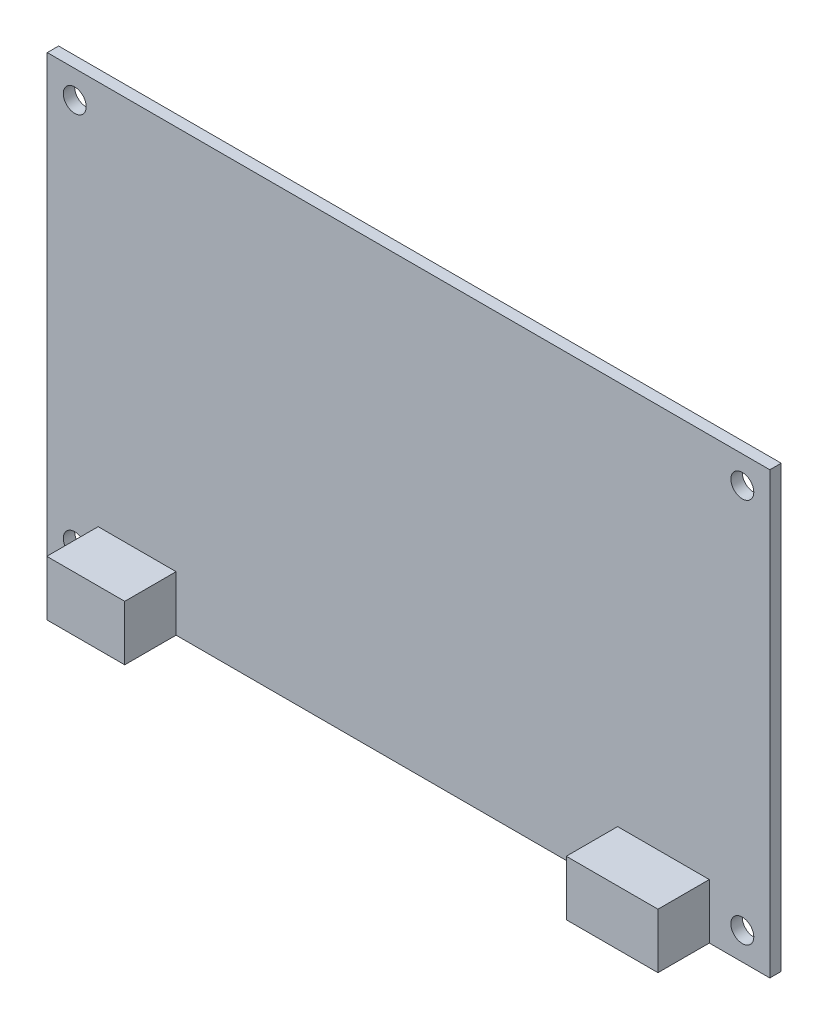
ISO-10303-21;
HEADER;
FILE_DESCRIPTION(('STEP AP214'),'2;1');
FILE_NAME('part.step','',(''),(''),'','','');
FILE_SCHEMA(('AUTOMOTIVE_DESIGN { 1 0 10303 214 1 1 1 1 }'));
ENDSEC;
DATA;
#1=APPLICATION_CONTEXT('core data for automotive mechanical design processes');
#2=APPLICATION_PROTOCOL_DEFINITION('international standard','automotive_design',2000,#1);
#3=PRODUCT_CONTEXT('',#1,'mechanical');
#4=PRODUCT('Part','Part','',(#3));
#5=PRODUCT_RELATED_PRODUCT_CATEGORY('part','',(#4));
#6=PRODUCT_DEFINITION_FORMATION('','',#4);
#7=PRODUCT_DEFINITION_CONTEXT('part definition',#1,'design');
#8=PRODUCT_DEFINITION('design','',#6,#7);
#9=PRODUCT_DEFINITION_SHAPE('','',#8);
#10=(LENGTH_UNIT() NAMED_UNIT(*) SI_UNIT(.MILLI.,.METRE.));
#11=(NAMED_UNIT(*) PLANE_ANGLE_UNIT() SI_UNIT($,.RADIAN.));
#12=(NAMED_UNIT(*) SI_UNIT($,.STERADIAN.) SOLID_ANGLE_UNIT());
#13=UNCERTAINTY_MEASURE_WITH_UNIT(LENGTH_MEASURE(1.E-05),#10,'distance_accuracy_value','');
#14=(GEOMETRIC_REPRESENTATION_CONTEXT(3) GLOBAL_UNCERTAINTY_ASSIGNED_CONTEXT((#13)) GLOBAL_UNIT_ASSIGNED_CONTEXT((#10,
#11,#12)) REPRESENTATION_CONTEXT('',''));
#15=CARTESIAN_POINT('',(0.,0.,0.));
#16=DIRECTION('',(0.,0.,1.));
#17=DIRECTION('',(1.,0.,0.));
#18=AXIS2_PLACEMENT_3D('',#15,#16,#17);
#19=CARTESIAN_POINT('',(0.,60.96,1.5748));
#20=DIRECTION('',(0.,0.,-1.));
#21=DIRECTION('',(-1.,0.,0.));
#22=AXIS2_PLACEMENT_3D('',#19,#20,#21);
#23=PLANE('',#22);
#24=CARTESIAN_POINT('',(96.266,3.80999999999999,1.5748));
#25=DIRECTION('',(0.,0.,1.));
#26=DIRECTION('',(1.,0.,0.));
#27=AXIS2_PLACEMENT_3D('',#24,#25,#26);
#28=CIRCLE('',#27,1.5875);
#29=CARTESIAN_POINT('',(97.8535,3.80999999999999,1.5748));
#30=VERTEX_POINT('',#29);
#31=EDGE_CURVE('E267',#30,#30,#28,.T.);
#32=ORIENTED_EDGE('',*,*,#31,.F.);
#33=EDGE_LOOP('',(#32));
#34=FACE_BOUND('',#33,.T.);
#35=CARTESIAN_POINT('',(3.81,57.15,1.5748));
#36=DIRECTION('',(0.,0.,1.));
#37=DIRECTION('',(1.,0.,0.));
#38=AXIS2_PLACEMENT_3D('',#35,#36,#37);
#39=CIRCLE('',#38,1.5875);
#40=CARTESIAN_POINT('',(5.3975,57.15,1.5748));
#41=VERTEX_POINT('',#40);
#42=EDGE_CURVE('E211',#41,#41,#39,.T.);
#43=ORIENTED_EDGE('',*,*,#42,.F.);
#44=EDGE_LOOP('',(#43));
#45=FACE_BOUND('',#44,.T.);
#46=CARTESIAN_POINT('',(96.266,57.15,1.5748));
#47=DIRECTION('',(0.,0.,1.));
#48=DIRECTION('',(1.,0.,0.));
#49=AXIS2_PLACEMENT_3D('',#46,#47,#48);
#50=CIRCLE('',#49,1.58749999999999);
#51=CARTESIAN_POINT('',(97.8535,57.15,1.5748));
#52=VERTEX_POINT('',#51);
#53=EDGE_CURVE('E273',#52,#52,#50,.T.);
#54=ORIENTED_EDGE('',*,*,#53,.F.);
#55=EDGE_LOOP('',(#54));
#56=FACE_BOUND('',#55,.T.);
#57=CARTESIAN_POINT('',(3.81,3.80999999999999,1.5748));
#58=DIRECTION('',(0.,0.,1.));
#59=DIRECTION('',(1.,0.,0.));
#60=AXIS2_PLACEMENT_3D('',#57,#58,#59);
#61=CIRCLE('',#60,1.5875);
#62=CARTESIAN_POINT('',(5.3975,3.80999999999999,1.5748));
#63=VERTEX_POINT('',#62);
#64=EDGE_CURVE('E261',#63,#63,#61,.T.);
#65=ORIENTED_EDGE('',*,*,#64,.F.);
#66=EDGE_LOOP('',(#65));
#67=FACE_BOUND('',#66,.T.);
#68=DIRECTION('',(0.,1.,0.));
#69=VECTOR('',#68,1.);
#70=CARTESIAN_POINT('',(91.694,7.62,1.5748));
#71=LINE('',#70,#69);
#72=CARTESIAN_POINT('',(91.694,0.,1.5748));
#73=VERTEX_POINT('',#72);
#74=CARTESIAN_POINT('',(91.694,7.62,1.5748));
#75=VERTEX_POINT('',#74);
#76=EDGE_CURVE('E144',#73,#75,#71,.T.);
#77=ORIENTED_EDGE('',*,*,#76,.F.);
#78=DIRECTION('',(1.,0.,0.));
#79=VECTOR('',#78,1.);
#80=CARTESIAN_POINT('',(0.,0.,1.5748));
#81=LINE('',#80,#79);
#82=CARTESIAN_POINT('',(100.076,0.,1.5748));
#83=VERTEX_POINT('',#82);
#84=EDGE_CURVE('E36',#73,#83,#81,.T.);
#85=ORIENTED_EDGE('',*,*,#84,.T.);
#86=DIRECTION('',(0.,1.,0.));
#87=VECTOR('',#86,1.);
#88=CARTESIAN_POINT('',(100.076,0.,1.5748));
#89=LINE('',#88,#87);
#90=CARTESIAN_POINT('',(100.076,60.96,1.5748));
#91=VERTEX_POINT('',#90);
#92=EDGE_CURVE('E200',#83,#91,#89,.T.);
#93=ORIENTED_EDGE('',*,*,#92,.T.);
#94=DIRECTION('',(-1.,0.,0.));
#95=VECTOR('',#94,1.);
#96=CARTESIAN_POINT('',(0.,60.96,1.5748));
#97=LINE('',#96,#95);
#98=CARTESIAN_POINT('',(0.,60.96,1.5748));
#99=VERTEX_POINT('',#98);
#100=EDGE_CURVE('E204',#91,#99,#97,.T.);
#101=ORIENTED_EDGE('',*,*,#100,.T.);
#102=DIRECTION('',(0.,-1.,0.));
#103=VECTOR('',#102,1.);
#104=CARTESIAN_POINT('',(0.,0.,1.5748));
#105=LINE('',#104,#103);
#106=CARTESIAN_POINT('',(0.,0.,1.5748));
#107=VERTEX_POINT('',#106);
#108=EDGE_CURVE('E198',#99,#107,#105,.T.);
#109=ORIENTED_EDGE('',*,*,#108,.T.);
#110=CARTESIAN_POINT('',(7.0485,0.,1.5748));
#111=VERTEX_POINT('',#110);
#112=EDGE_CURVE('E194',#107,#111,#81,.T.);
#113=ORIENTED_EDGE('',*,*,#112,.T.);
#114=DIRECTION('',(0.,-1.,0.));
#115=VECTOR('',#114,1.);
#116=CARTESIAN_POINT('',(7.0485,7.62,1.5748));
#117=LINE('',#116,#115);
#118=CARTESIAN_POINT('',(7.0485,7.62,1.5748));
#119=VERTEX_POINT('',#118);
#120=EDGE_CURVE('E158',#119,#111,#117,.T.);
#121=ORIENTED_EDGE('',*,*,#120,.F.);
#122=DIRECTION('',(-1.,0.,0.));
#123=VECTOR('',#122,1.);
#124=CARTESIAN_POINT('',(7.0485,7.62,1.5748));
#125=LINE('',#124,#123);
#126=CARTESIAN_POINT('',(17.8435,7.62,1.5748));
#127=VERTEX_POINT('',#126);
#128=EDGE_CURVE('E148',#127,#119,#125,.T.);
#129=ORIENTED_EDGE('',*,*,#128,.F.);
#130=DIRECTION('',(0.,1.,0.));
#131=VECTOR('',#130,1.);
#132=CARTESIAN_POINT('',(17.8435,7.62,1.5748));
#133=LINE('',#132,#131);
#134=CARTESIAN_POINT('',(17.8435,0.,1.5748));
#135=VERTEX_POINT('',#134);
#136=EDGE_CURVE('E145',#135,#127,#133,.T.);
#137=ORIENTED_EDGE('',*,*,#136,.F.);
#138=CARTESIAN_POINT('',(78.994,0.,1.5748));
#139=VERTEX_POINT('',#138);
#140=EDGE_CURVE('E192',#135,#139,#81,.T.);
#141=ORIENTED_EDGE('',*,*,#140,.T.);
#142=DIRECTION('',(0.,-1.,0.));
#143=VECTOR('',#142,1.);
#144=CARTESIAN_POINT('',(78.994,7.62,1.5748));
#145=LINE('',#144,#143);
#146=CARTESIAN_POINT('',(78.994,7.61999999999999,1.5748));
#147=VERTEX_POINT('',#146);
#148=EDGE_CURVE('E55',#147,#139,#145,.T.);
#149=ORIENTED_EDGE('',*,*,#148,.F.);
#150=DIRECTION('',(-1.,0.,0.));
#151=VECTOR('',#150,1.);
#152=CARTESIAN_POINT('',(78.994,7.62,1.5748));
#153=LINE('',#152,#151);
#154=EDGE_CURVE('E50',#75,#147,#153,.T.);
#155=ORIENTED_EDGE('',*,*,#154,.F.);
#156=EDGE_LOOP('',(#77,#85,#93,#101,#109,#113,#121,#129,#137,#141,#149,#155));
#157=FACE_BOUND('',#156,.T.);
#158=ADVANCED_FACE('F32',(#34,#45,#56,#67,#157),#23,.F.);
#159=CARTESIAN_POINT('',(0.,60.96,0.));
#160=DIRECTION('',(0.,0.,-1.));
#161=DIRECTION('',(-1.,0.,0.));
#162=AXIS2_PLACEMENT_3D('',#159,#160,#161);
#163=PLANE('',#162);
#164=CARTESIAN_POINT('',(96.266,3.80999999999999,0.));
#165=DIRECTION('',(0.,0.,1.));
#166=DIRECTION('',(1.,0.,0.));
#167=AXIS2_PLACEMENT_3D('',#164,#165,#166);
#168=CIRCLE('',#167,1.5875);
#169=CARTESIAN_POINT('',(97.8535,3.80999999999999,0.));
#170=VERTEX_POINT('',#169);
#171=EDGE_CURVE('E265',#170,#170,#168,.T.);
#172=ORIENTED_EDGE('',*,*,#171,.T.);
#173=EDGE_LOOP('',(#172));
#174=FACE_BOUND('',#173,.T.);
#175=CARTESIAN_POINT('',(3.81,57.15,0.));
#176=DIRECTION('',(0.,0.,1.));
#177=DIRECTION('',(1.,0.,0.));
#178=AXIS2_PLACEMENT_3D('',#175,#176,#177);
#179=CIRCLE('',#178,1.5875);
#180=CARTESIAN_POINT('',(5.3975,57.15,0.));
#181=VERTEX_POINT('',#180);
#182=EDGE_CURVE('E276',#181,#181,#179,.T.);
#183=ORIENTED_EDGE('',*,*,#182,.T.);
#184=EDGE_LOOP('',(#183));
#185=FACE_BOUND('',#184,.T.);
#186=DIRECTION('',(0.,-1.,0.));
#187=VECTOR('',#186,1.);
#188=CARTESIAN_POINT('',(0.,0.,0.));
#189=LINE('',#188,#187);
#190=CARTESIAN_POINT('',(0.,60.96,0.));
#191=VERTEX_POINT('',#190);
#192=CARTESIAN_POINT('',(0.,0.,0.));
#193=VERTEX_POINT('',#192);
#194=EDGE_CURVE('E207',#191,#193,#189,.T.);
#195=ORIENTED_EDGE('',*,*,#194,.F.);
#196=DIRECTION('',(-1.,0.,0.));
#197=VECTOR('',#196,1.);
#198=CARTESIAN_POINT('',(0.,60.96,0.));
#199=LINE('',#198,#197);
#200=CARTESIAN_POINT('',(100.076,60.96,0.));
#201=VERTEX_POINT('',#200);
#202=EDGE_CURVE('E215',#201,#191,#199,.T.);
#203=ORIENTED_EDGE('',*,*,#202,.F.);
#204=DIRECTION('',(0.,1.,0.));
#205=VECTOR('',#204,1.);
#206=CARTESIAN_POINT('',(100.076,0.,0.));
#207=LINE('',#206,#205);
#208=CARTESIAN_POINT('',(100.076,0.,0.));
#209=VERTEX_POINT('',#208);
#210=EDGE_CURVE('E213',#209,#201,#207,.T.);
#211=ORIENTED_EDGE('',*,*,#210,.F.);
#212=DIRECTION('',(1.,0.,0.));
#213=VECTOR('',#212,1.);
#214=CARTESIAN_POINT('',(0.,0.,0.));
#215=LINE('',#214,#213);
#216=EDGE_CURVE('E210',#193,#209,#215,.T.);
#217=ORIENTED_EDGE('',*,*,#216,.F.);
#218=EDGE_LOOP('',(#195,#203,#211,#217));
#219=FACE_BOUND('',#218,.T.);
#220=CARTESIAN_POINT('',(96.266,57.15,0.));
#221=DIRECTION('',(0.,0.,1.));
#222=DIRECTION('',(1.,0.,0.));
#223=AXIS2_PLACEMENT_3D('',#220,#221,#222);
#224=CIRCLE('',#223,1.58749999999999);
#225=CARTESIAN_POINT('',(97.8535,57.15,0.));
#226=VERTEX_POINT('',#225);
#227=EDGE_CURVE('E270',#226,#226,#224,.T.);
#228=ORIENTED_EDGE('',*,*,#227,.T.);
#229=EDGE_LOOP('',(#228));
#230=FACE_BOUND('',#229,.T.);
#231=CARTESIAN_POINT('',(3.81,3.80999999999999,0.));
#232=DIRECTION('',(0.,0.,1.));
#233=DIRECTION('',(1.,0.,0.));
#234=AXIS2_PLACEMENT_3D('',#231,#232,#233);
#235=CIRCLE('',#234,1.5875);
#236=CARTESIAN_POINT('',(5.3975,3.80999999999999,0.));
#237=VERTEX_POINT('',#236);
#238=EDGE_CURVE('E259',#237,#237,#235,.T.);
#239=ORIENTED_EDGE('',*,*,#238,.T.);
#240=EDGE_LOOP('',(#239));
#241=FACE_BOUND('',#240,.T.);
#242=ADVANCED_FACE('F232',(#174,#185,#219,#230,#241),#163,.T.);
#243=CARTESIAN_POINT('',(0.,0.,1.5748));
#244=DIRECTION('',(1.,0.,0.));
#245=DIRECTION('',(0.,0.,-1.));
#246=AXIS2_PLACEMENT_3D('',#243,#244,#245);
#247=PLANE('',#246);
#248=ORIENTED_EDGE('',*,*,#194,.T.);
#249=DIRECTION('',(0.,0.,-1.));
#250=VECTOR('',#249,1.);
#251=CARTESIAN_POINT('',(0.,0.,1.5748));
#252=LINE('',#251,#250);
#253=EDGE_CURVE('E11',#107,#193,#252,.T.);
#254=ORIENTED_EDGE('',*,*,#253,.F.);
#255=ORIENTED_EDGE('',*,*,#108,.F.);
#256=DIRECTION('',(0.,0.,-1.));
#257=VECTOR('',#256,1.);
#258=CARTESIAN_POINT('',(0.,60.96,1.5748));
#259=LINE('',#258,#257);
#260=EDGE_CURVE('E206',#99,#191,#259,.T.);
#261=ORIENTED_EDGE('',*,*,#260,.T.);
#262=EDGE_LOOP('',(#248,#254,#255,#261));
#263=FACE_BOUND('',#262,.T.);
#264=ADVANCED_FACE('F34',(#263),#247,.F.);
#265=CARTESIAN_POINT('',(0.,0.,1.5748));
#266=DIRECTION('',(0.,1.,0.));
#267=DIRECTION('',(0.,0.,1.));
#268=AXIS2_PLACEMENT_3D('',#265,#266,#267);
#269=PLANE('',#268);
#270=ORIENTED_EDGE('',*,*,#216,.T.);
#271=DIRECTION('',(0.,0.,-1.));
#272=VECTOR('',#271,1.);
#273=CARTESIAN_POINT('',(100.076,0.,1.5748));
#274=LINE('',#273,#272);
#275=EDGE_CURVE('E42',#83,#209,#274,.T.);
#276=ORIENTED_EDGE('',*,*,#275,.F.);
#277=ORIENTED_EDGE('',*,*,#84,.F.);
#278=DIRECTION('',(0.,0.,-1.));
#279=VECTOR('',#278,1.);
#280=CARTESIAN_POINT('',(91.694,0.,8.6868));
#281=LINE('',#280,#279);
#282=CARTESIAN_POINT('',(91.694,0.,8.6868));
#283=VERTEX_POINT('',#282);
#284=EDGE_CURVE('E243',#283,#73,#281,.T.);
#285=ORIENTED_EDGE('',*,*,#284,.F.);
#286=DIRECTION('',(1.,0.,0.));
#287=VECTOR('',#286,1.);
#288=CARTESIAN_POINT('',(78.994,0.,8.6868));
#289=LINE('',#288,#287);
#290=CARTESIAN_POINT('',(78.994,0.,8.6868));
#291=VERTEX_POINT('',#290);
#292=EDGE_CURVE('E138',#291,#283,#289,.T.);
#293=ORIENTED_EDGE('',*,*,#292,.F.);
#294=DIRECTION('',(0.,0.,-1.));
#295=VECTOR('',#294,1.);
#296=CARTESIAN_POINT('',(78.994,0.,8.6868));
#297=LINE('',#296,#295);
#298=EDGE_CURVE('E150',#291,#139,#297,.T.);
#299=ORIENTED_EDGE('',*,*,#298,.T.);
#300=ORIENTED_EDGE('',*,*,#140,.F.);
#301=DIRECTION('',(0.,0.,-1.));
#302=VECTOR('',#301,1.);
#303=CARTESIAN_POINT('',(17.8435,0.,8.6868));
#304=LINE('',#303,#302);
#305=CARTESIAN_POINT('',(17.8435,0.,8.6868));
#306=VERTEX_POINT('',#305);
#307=EDGE_CURVE('E164',#306,#135,#304,.T.);
#308=ORIENTED_EDGE('',*,*,#307,.F.);
#309=DIRECTION('',(1.,0.,0.));
#310=VECTOR('',#309,1.);
#311=CARTESIAN_POINT('',(7.0485,0.,8.6868));
#312=LINE('',#311,#310);
#313=CARTESIAN_POINT('',(7.0485,0.,8.6868));
#314=VERTEX_POINT('',#313);
#315=EDGE_CURVE('E162',#314,#306,#312,.T.);
#316=ORIENTED_EDGE('',*,*,#315,.F.);
#317=DIRECTION('',(0.,0.,-1.));
#318=VECTOR('',#317,1.);
#319=CARTESIAN_POINT('',(7.0485,0.,8.6868));
#320=LINE('',#319,#318);
#321=EDGE_CURVE('E177',#314,#111,#320,.T.);
#322=ORIENTED_EDGE('',*,*,#321,.T.);
#323=ORIENTED_EDGE('',*,*,#112,.F.);
#324=ORIENTED_EDGE('',*,*,#253,.T.);
#325=EDGE_LOOP('',(#270,#276,#277,#285,#293,#299,#300,#308,#316,#322,#323,#324));
#326=FACE_BOUND('',#325,.T.);
#327=ADVANCED_FACE('F242',(#326),#269,.F.);
#328=CARTESIAN_POINT('',(100.076,0.,1.5748));
#329=DIRECTION('',(-1.,0.,0.));
#330=DIRECTION('',(0.,0.,1.));
#331=AXIS2_PLACEMENT_3D('',#328,#329,#330);
#332=PLANE('',#331);
#333=ORIENTED_EDGE('',*,*,#210,.T.);
#334=DIRECTION('',(0.,0.,-1.));
#335=VECTOR('',#334,1.);
#336=CARTESIAN_POINT('',(100.076,60.96,1.5748));
#337=LINE('',#336,#335);
#338=EDGE_CURVE('E219',#91,#201,#337,.T.);
#339=ORIENTED_EDGE('',*,*,#338,.F.);
#340=ORIENTED_EDGE('',*,*,#92,.F.);
#341=ORIENTED_EDGE('',*,*,#275,.T.);
#342=EDGE_LOOP('',(#333,#339,#340,#341));
#343=FACE_BOUND('',#342,.T.);
#344=ADVANCED_FACE('F227',(#343),#332,.F.);
#345=CARTESIAN_POINT('',(0.,60.96,1.5748));
#346=DIRECTION('',(0.,-1.,0.));
#347=DIRECTION('',(0.,0.,-1.));
#348=AXIS2_PLACEMENT_3D('',#345,#346,#347);
#349=PLANE('',#348);
#350=ORIENTED_EDGE('',*,*,#202,.T.);
#351=ORIENTED_EDGE('',*,*,#260,.F.);
#352=ORIENTED_EDGE('',*,*,#100,.F.);
#353=ORIENTED_EDGE('',*,*,#338,.T.);
#354=EDGE_LOOP('',(#350,#351,#352,#353));
#355=FACE_BOUND('',#354,.T.);
#356=ADVANCED_FACE('F236',(#355),#349,.F.);
#357=CARTESIAN_POINT('',(3.81,57.15,1.5748));
#358=DIRECTION('',(0.,0.,-1.));
#359=DIRECTION('',(-1.,0.,0.));
#360=AXIS2_PLACEMENT_3D('',#357,#358,#359);
#361=CYLINDRICAL_SURFACE('',#360,1.5875);
#362=ORIENTED_EDGE('',*,*,#42,.T.);
#363=EDGE_LOOP('',(#362));
#364=FACE_BOUND('',#363,.T.);
#365=ORIENTED_EDGE('',*,*,#182,.F.);
#366=EDGE_LOOP('',(#365));
#367=FACE_BOUND('',#366,.T.);
#368=ADVANCED_FACE('F284',(#364,#367),#361,.F.);
#369=CARTESIAN_POINT('',(96.266,57.15,1.5748));
#370=DIRECTION('',(0.,0.,-1.));
#371=DIRECTION('',(-1.,0.,0.));
#372=AXIS2_PLACEMENT_3D('',#369,#370,#371);
#373=CYLINDRICAL_SURFACE('',#372,1.58749999999999);
#374=ORIENTED_EDGE('',*,*,#53,.T.);
#375=EDGE_LOOP('',(#374));
#376=FACE_BOUND('',#375,.T.);
#377=ORIENTED_EDGE('',*,*,#227,.F.);
#378=EDGE_LOOP('',(#377));
#379=FACE_BOUND('',#378,.T.);
#380=ADVANCED_FACE('F286',(#376,#379),#373,.F.);
#381=CARTESIAN_POINT('',(96.266,3.80999999999999,1.5748));
#382=DIRECTION('',(0.,0.,-1.));
#383=DIRECTION('',(-1.,0.,0.));
#384=AXIS2_PLACEMENT_3D('',#381,#382,#383);
#385=CYLINDRICAL_SURFACE('',#384,1.5875);
#386=ORIENTED_EDGE('',*,*,#31,.T.);
#387=EDGE_LOOP('',(#386));
#388=FACE_BOUND('',#387,.T.);
#389=ORIENTED_EDGE('',*,*,#171,.F.);
#390=EDGE_LOOP('',(#389));
#391=FACE_BOUND('',#390,.T.);
#392=ADVANCED_FACE('F293',(#388,#391),#385,.F.);
#393=CARTESIAN_POINT('',(3.81,3.80999999999999,1.5748));
#394=DIRECTION('',(0.,0.,-1.));
#395=DIRECTION('',(-1.,0.,0.));
#396=AXIS2_PLACEMENT_3D('',#393,#394,#395);
#397=CYLINDRICAL_SURFACE('',#396,1.5875);
#398=ORIENTED_EDGE('',*,*,#64,.T.);
#399=EDGE_LOOP('',(#398));
#400=FACE_BOUND('',#399,.T.);
#401=ORIENTED_EDGE('',*,*,#238,.F.);
#402=EDGE_LOOP('',(#401));
#403=FACE_BOUND('',#402,.T.);
#404=ADVANCED_FACE('F358',(#400,#403),#397,.F.);
#405=CARTESIAN_POINT('',(17.8435,7.62,8.6868));
#406=DIRECTION('',(-1.,0.,0.));
#407=DIRECTION('',(0.,-1.,0.));
#408=AXIS2_PLACEMENT_3D('',#405,#406,#407);
#409=PLANE('',#408);
#410=ORIENTED_EDGE('',*,*,#136,.T.);
#411=DIRECTION('',(0.,0.,-1.));
#412=VECTOR('',#411,1.);
#413=CARTESIAN_POINT('',(17.8435,7.62,8.6868));
#414=LINE('',#413,#412);
#415=CARTESIAN_POINT('',(17.8435,7.62,8.6868));
#416=VERTEX_POINT('',#415);
#417=EDGE_CURVE('E184',#416,#127,#414,.T.);
#418=ORIENTED_EDGE('',*,*,#417,.F.);
#419=DIRECTION('',(0.,1.,0.));
#420=VECTOR('',#419,1.);
#421=CARTESIAN_POINT('',(17.8435,7.62,8.6868));
#422=LINE('',#421,#420);
#423=EDGE_CURVE('E154',#306,#416,#422,.T.);
#424=ORIENTED_EDGE('',*,*,#423,.F.);
#425=ORIENTED_EDGE('',*,*,#307,.T.);
#426=EDGE_LOOP('',(#410,#418,#424,#425));
#427=FACE_BOUND('',#426,.T.);
#428=ADVANCED_FACE('F257',(#427),#409,.F.);
#429=CARTESIAN_POINT('',(7.0485,7.62,8.6868));
#430=DIRECTION('',(0.,-1.,0.));
#431=DIRECTION('',(1.,0.,0.));
#432=AXIS2_PLACEMENT_3D('',#429,#430,#431);
#433=PLANE('',#432);
#434=ORIENTED_EDGE('',*,*,#128,.T.);
#435=DIRECTION('',(0.,0.,-1.));
#436=VECTOR('',#435,1.);
#437=CARTESIAN_POINT('',(7.0485,7.62,8.6868));
#438=LINE('',#437,#436);
#439=CARTESIAN_POINT('',(7.0485,7.62,8.6868));
#440=VERTEX_POINT('',#439);
#441=EDGE_CURVE('E169',#440,#119,#438,.T.);
#442=ORIENTED_EDGE('',*,*,#441,.F.);
#443=DIRECTION('',(-1.,0.,0.));
#444=VECTOR('',#443,1.);
#445=CARTESIAN_POINT('',(7.0485,7.62,8.6868));
#446=LINE('',#445,#444);
#447=EDGE_CURVE('E157',#416,#440,#446,.T.);
#448=ORIENTED_EDGE('',*,*,#447,.F.);
#449=ORIENTED_EDGE('',*,*,#417,.T.);
#450=EDGE_LOOP('',(#434,#442,#448,#449));
#451=FACE_BOUND('',#450,.T.);
#452=ADVANCED_FACE('F380',(#451),#433,.F.);
#453=CARTESIAN_POINT('',(7.0485,7.62,8.6868));
#454=DIRECTION('',(1.,0.,0.));
#455=DIRECTION('',(0.,1.,0.));
#456=AXIS2_PLACEMENT_3D('',#453,#454,#455);
#457=PLANE('',#456);
#458=ORIENTED_EDGE('',*,*,#120,.T.);
#459=ORIENTED_EDGE('',*,*,#321,.F.);
#460=DIRECTION('',(0.,-1.,0.));
#461=VECTOR('',#460,1.);
#462=CARTESIAN_POINT('',(7.0485,7.62,8.6868));
#463=LINE('',#462,#461);
#464=EDGE_CURVE('E160',#440,#314,#463,.T.);
#465=ORIENTED_EDGE('',*,*,#464,.F.);
#466=ORIENTED_EDGE('',*,*,#441,.T.);
#467=EDGE_LOOP('',(#458,#459,#465,#466));
#468=FACE_BOUND('',#467,.T.);
#469=ADVANCED_FACE('F389',(#468),#457,.F.);
#470=CARTESIAN_POINT('',(17.8435,0.,8.6868));
#471=DIRECTION('',(0.,0.,1.));
#472=DIRECTION('',(1.,0.,0.));
#473=AXIS2_PLACEMENT_3D('',#470,#471,#472);
#474=PLANE('',#473);
#475=ORIENTED_EDGE('',*,*,#423,.T.);
#476=ORIENTED_EDGE('',*,*,#447,.T.);
#477=ORIENTED_EDGE('',*,*,#464,.T.);
#478=ORIENTED_EDGE('',*,*,#315,.T.);
#479=EDGE_LOOP('',(#475,#476,#477,#478));
#480=FACE_BOUND('',#479,.T.);
#481=ADVANCED_FACE('F398',(#480),#474,.T.);
#482=CARTESIAN_POINT('',(91.694,7.62,8.6868));
#483=DIRECTION('',(-1.,0.,0.));
#484=DIRECTION('',(0.,0.,1.));
#485=AXIS2_PLACEMENT_3D('',#482,#483,#484);
#486=PLANE('',#485);
#487=ORIENTED_EDGE('',*,*,#76,.T.);
#488=DIRECTION('',(0.,0.,-1.));
#489=VECTOR('',#488,1.);
#490=CARTESIAN_POINT('',(91.694,7.62,8.6868));
#491=LINE('',#490,#489);
#492=CARTESIAN_POINT('',(91.694,7.62,8.6868));
#493=VERTEX_POINT('',#492);
#494=EDGE_CURVE('E126',#493,#75,#491,.T.);
#495=ORIENTED_EDGE('',*,*,#494,.F.);
#496=DIRECTION('',(0.,1.,0.));
#497=VECTOR('',#496,1.);
#498=CARTESIAN_POINT('',(91.694,7.62,8.6868));
#499=LINE('',#498,#497);
#500=EDGE_CURVE('E133',#283,#493,#499,.T.);
#501=ORIENTED_EDGE('',*,*,#500,.F.);
#502=ORIENTED_EDGE('',*,*,#284,.T.);
#503=EDGE_LOOP('',(#487,#495,#501,#502));
#504=FACE_BOUND('',#503,.T.);
#505=ADVANCED_FACE('F143',(#504),#486,.F.);
#506=CARTESIAN_POINT('',(78.994,7.62,8.6868));
#507=DIRECTION('',(0.,-1.,0.));
#508=DIRECTION('',(0.,0.,-1.));
#509=AXIS2_PLACEMENT_3D('',#506,#507,#508);
#510=PLANE('',#509);
#511=ORIENTED_EDGE('',*,*,#154,.T.);
#512=DIRECTION('',(0.,0.,-1.));
#513=VECTOR('',#512,1.);
#514=CARTESIAN_POINT('',(78.994,7.62,8.6868));
#515=LINE('',#514,#513);
#516=CARTESIAN_POINT('',(78.994,7.62,8.6868));
#517=VERTEX_POINT('',#516);
#518=EDGE_CURVE('E129',#517,#147,#515,.T.);
#519=ORIENTED_EDGE('',*,*,#518,.F.);
#520=DIRECTION('',(-1.,0.,0.));
#521=VECTOR('',#520,1.);
#522=CARTESIAN_POINT('',(78.994,7.62,8.6868));
#523=LINE('',#522,#521);
#524=EDGE_CURVE('E122',#493,#517,#523,.T.);
#525=ORIENTED_EDGE('',*,*,#524,.F.);
#526=ORIENTED_EDGE('',*,*,#494,.T.);
#527=EDGE_LOOP('',(#511,#519,#525,#526));
#528=FACE_BOUND('',#527,.T.);
#529=ADVANCED_FACE('F124',(#528),#510,.F.);
#530=CARTESIAN_POINT('',(78.994,7.62,8.6868));
#531=DIRECTION('',(1.,0.,0.));
#532=DIRECTION('',(0.,0.,-1.));
#533=AXIS2_PLACEMENT_3D('',#530,#531,#532);
#534=PLANE('',#533);
#535=ORIENTED_EDGE('',*,*,#148,.T.);
#536=ORIENTED_EDGE('',*,*,#298,.F.);
#537=DIRECTION('',(0.,-1.,0.));
#538=VECTOR('',#537,1.);
#539=CARTESIAN_POINT('',(78.994,7.62,8.6868));
#540=LINE('',#539,#538);
#541=EDGE_CURVE('E132',#517,#291,#540,.T.);
#542=ORIENTED_EDGE('',*,*,#541,.F.);
#543=ORIENTED_EDGE('',*,*,#518,.T.);
#544=EDGE_LOOP('',(#535,#536,#542,#543));
#545=FACE_BOUND('',#544,.T.);
#546=ADVANCED_FACE('F253',(#545),#534,.F.);
#547=CARTESIAN_POINT('',(91.694,0.,8.6868));
#548=DIRECTION('',(0.,0.,1.));
#549=DIRECTION('',(1.,0.,0.));
#550=AXIS2_PLACEMENT_3D('',#547,#548,#549);
#551=PLANE('',#550);
#552=ORIENTED_EDGE('',*,*,#500,.T.);
#553=ORIENTED_EDGE('',*,*,#524,.T.);
#554=ORIENTED_EDGE('',*,*,#541,.T.);
#555=ORIENTED_EDGE('',*,*,#292,.T.);
#556=EDGE_LOOP('',(#552,#553,#554,#555));
#557=FACE_BOUND('',#556,.T.);
#558=ADVANCED_FACE('F136',(#557),#551,.T.);
#559=CLOSED_SHELL('',(#158,#242,#264,#327,#344,#356,#368,#380,#392,#404,#428,#452,#469,#481,
#505,#529,#546,#558));
#560=MANIFOLD_SOLID_BREP('B2',#559);
#561=ADVANCED_BREP_SHAPE_REPRESENTATION('',(#18,#560),#14);
#562=SHAPE_DEFINITION_REPRESENTATION(#9,#561);
ENDSEC;
END-ISO-10303-21;
